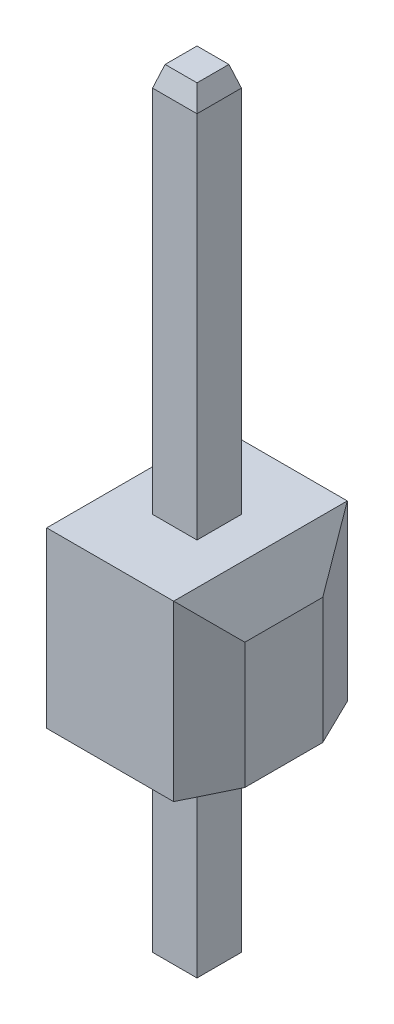
ISO-10303-21;
HEADER;
FILE_DESCRIPTION(('STEP AP214'),'2;1');
FILE_NAME('part.step','',(''),(''),'','','');
FILE_SCHEMA(('AUTOMOTIVE_DESIGN { 1 0 10303 214 1 1 1 1 }'));
ENDSEC;
DATA;
#1=APPLICATION_CONTEXT('core data for automotive mechanical design processes');
#2=APPLICATION_PROTOCOL_DEFINITION('international standard','automotive_design',2000,#1);
#3=PRODUCT_CONTEXT('',#1,'mechanical');
#4=PRODUCT('Part','Part','',(#3));
#5=PRODUCT_RELATED_PRODUCT_CATEGORY('part','',(#4));
#6=PRODUCT_DEFINITION_FORMATION('','',#4);
#7=PRODUCT_DEFINITION_CONTEXT('part definition',#1,'design');
#8=PRODUCT_DEFINITION('design','',#6,#7);
#9=PRODUCT_DEFINITION_SHAPE('','',#8);
#10=(LENGTH_UNIT() NAMED_UNIT(*) SI_UNIT(.MILLI.,.METRE.));
#11=(NAMED_UNIT(*) PLANE_ANGLE_UNIT() SI_UNIT($,.RADIAN.));
#12=(NAMED_UNIT(*) SI_UNIT($,.STERADIAN.) SOLID_ANGLE_UNIT());
#13=UNCERTAINTY_MEASURE_WITH_UNIT(LENGTH_MEASURE(1.E-05),#10,'distance_accuracy_value','');
#14=(GEOMETRIC_REPRESENTATION_CONTEXT(3) GLOBAL_UNCERTAINTY_ASSIGNED_CONTEXT((#13)) GLOBAL_UNIT_ASSIGNED_CONTEXT((#10,
#11,#12)) REPRESENTATION_CONTEXT('',''));
#15=CARTESIAN_POINT('',(0.,0.,0.));
#16=DIRECTION('',(0.,0.,1.));
#17=DIRECTION('',(1.,0.,0.));
#18=AXIS2_PLACEMENT_3D('',#15,#16,#17);
#19=CARTESIAN_POINT('',(1.27,2.54,1.27));
#20=DIRECTION('',(-1.,0.,0.));
#21=DIRECTION('',(0.,0.,1.));
#22=AXIS2_PLACEMENT_3D('',#19,#20,#21);
#23=PLANE('',#22);
#24=DIRECTION('',(0.,0.,-1.));
#25=VECTOR('',#24,1.);
#26=CARTESIAN_POINT('',(1.27,0.,1.27));
#27=LINE('',#26,#25);
#28=CARTESIAN_POINT('',(1.27,0.,0.569999999999992));
#29=VERTEX_POINT('',#28);
#30=CARTESIAN_POINT('',(1.27,0.,-0.569999999999992));
#31=VERTEX_POINT('',#30);
#32=EDGE_CURVE('E206',#29,#31,#27,.T.);
#33=ORIENTED_EDGE('',*,*,#32,.T.);
#34=DIRECTION('',(0.,1.,0.));
#35=VECTOR('',#34,1.);
#36=CARTESIAN_POINT('',(1.27,2.54,-0.569999999999992));
#37=LINE('',#36,#35);
#38=CARTESIAN_POINT('',(1.27,1.83999999999999,-0.569999999999992));
#39=VERTEX_POINT('',#38);
#40=EDGE_CURVE('E300',#31,#39,#37,.T.);
#41=ORIENTED_EDGE('',*,*,#40,.T.);
#42=DIRECTION('',(0.,0.,1.));
#43=VECTOR('',#42,1.);
#44=CARTESIAN_POINT('',(1.27,1.83999999999999,1.27));
#45=LINE('',#44,#43);
#46=CARTESIAN_POINT('',(1.27,1.83999999999999,0.569999999999992));
#47=VERTEX_POINT('',#46);
#48=EDGE_CURVE('E296',#39,#47,#45,.T.);
#49=ORIENTED_EDGE('',*,*,#48,.T.);
#50=DIRECTION('',(0.,-1.,0.));
#51=VECTOR('',#50,1.);
#52=CARTESIAN_POINT('',(1.27,2.54,0.569999999999992));
#53=LINE('',#52,#51);
#54=EDGE_CURVE('E298',#47,#29,#53,.T.);
#55=ORIENTED_EDGE('',*,*,#54,.T.);
#56=EDGE_LOOP('',(#33,#41,#49,#55));
#57=FACE_BOUND('',#56,.T.);
#58=ADVANCED_FACE('F35',(#57),#23,.F.);
#59=CARTESIAN_POINT('',(-1.27,2.54,-1.27));
#60=DIRECTION('',(0.,0.,1.));
#61=DIRECTION('',(1.,0.,0.));
#62=AXIS2_PLACEMENT_3D('',#59,#60,#61);
#63=PLANE('',#62);
#64=DIRECTION('',(-1.,0.,0.));
#65=VECTOR('',#64,1.);
#66=CARTESIAN_POINT('',(-1.27,0.,-1.27));
#67=LINE('',#66,#65);
#68=CARTESIAN_POINT('',(0.928587188003895,0.,-1.27));
#69=VERTEX_POINT('',#68);
#70=CARTESIAN_POINT('',(-0.928587188003895,0.,-1.27));
#71=VERTEX_POINT('',#70);
#72=EDGE_CURVE('E215',#69,#71,#67,.T.);
#73=ORIENTED_EDGE('',*,*,#72,.T.);
#74=DIRECTION('',(0.,1.,0.));
#75=VECTOR('',#74,1.);
#76=CARTESIAN_POINT('',(-0.928587188003895,2.54,-1.27));
#77=LINE('',#76,#75);
#78=CARTESIAN_POINT('',(-0.928587188003895,2.54,-1.27));
#79=VERTEX_POINT('',#78);
#80=EDGE_CURVE('E58',#71,#79,#77,.T.);
#81=ORIENTED_EDGE('',*,*,#80,.T.);
#82=DIRECTION('',(-1.,0.,0.));
#83=VECTOR('',#82,1.);
#84=CARTESIAN_POINT('',(-1.27,2.54,-1.27));
#85=LINE('',#84,#83);
#86=CARTESIAN_POINT('',(0.928587188003895,2.54,-1.27));
#87=VERTEX_POINT('',#86);
#88=EDGE_CURVE('E207',#87,#79,#85,.T.);
#89=ORIENTED_EDGE('',*,*,#88,.F.);
#90=DIRECTION('',(0.,-1.,0.));
#91=VECTOR('',#90,1.);
#92=CARTESIAN_POINT('',(0.928587188003895,2.54,-1.27));
#93=LINE('',#92,#91);
#94=EDGE_CURVE('E267',#87,#69,#93,.T.);
#95=ORIENTED_EDGE('',*,*,#94,.T.);
#96=EDGE_LOOP('',(#73,#81,#89,#95));
#97=FACE_BOUND('',#96,.T.);
#98=ADVANCED_FACE('F357',(#97),#63,.F.);
#99=CARTESIAN_POINT('',(-1.27,2.54,1.27));
#100=DIRECTION('',(1.,0.,0.));
#101=DIRECTION('',(0.,0.,-1.));
#102=AXIS2_PLACEMENT_3D('',#99,#100,#101);
#103=PLANE('',#102);
#104=DIRECTION('',(0.,0.,-1.));
#105=VECTOR('',#104,1.);
#106=CARTESIAN_POINT('',(-1.27,1.83999999999999,1.27));
#107=LINE('',#106,#105);
#108=CARTESIAN_POINT('',(-1.27,1.83999999999999,0.569999999999992));
#109=VERTEX_POINT('',#108);
#110=CARTESIAN_POINT('',(-1.27,1.83999999999999,-0.569999999999992));
#111=VERTEX_POINT('',#110);
#112=EDGE_CURVE('E307',#109,#111,#107,.T.);
#113=ORIENTED_EDGE('',*,*,#112,.T.);
#114=DIRECTION('',(0.,-1.,0.));
#115=VECTOR('',#114,1.);
#116=CARTESIAN_POINT('',(-1.27,2.54,-0.569999999999992));
#117=LINE('',#116,#115);
#118=CARTESIAN_POINT('',(-1.27,0.,-0.569999999999992));
#119=VERTEX_POINT('',#118);
#120=EDGE_CURVE('E316',#111,#119,#117,.T.);
#121=ORIENTED_EDGE('',*,*,#120,.T.);
#122=DIRECTION('',(0.,0.,1.));
#123=VECTOR('',#122,1.);
#124=CARTESIAN_POINT('',(-1.27,0.,1.27));
#125=LINE('',#124,#123);
#126=CARTESIAN_POINT('',(-1.27,0.,0.569999999999992));
#127=VERTEX_POINT('',#126);
#128=EDGE_CURVE('E217',#119,#127,#125,.T.);
#129=ORIENTED_EDGE('',*,*,#128,.T.);
#130=DIRECTION('',(0.,1.,0.));
#131=VECTOR('',#130,1.);
#132=CARTESIAN_POINT('',(-1.27,2.54,0.569999999999992));
#133=LINE('',#132,#131);
#134=EDGE_CURVE('E314',#127,#109,#133,.T.);
#135=ORIENTED_EDGE('',*,*,#134,.T.);
#136=EDGE_LOOP('',(#113,#121,#129,#135));
#137=FACE_BOUND('',#136,.T.);
#138=ADVANCED_FACE('F362',(#137),#103,.F.);
#139=CARTESIAN_POINT('',(-1.27,2.54,1.27));
#140=DIRECTION('',(0.,0.,-1.));
#141=DIRECTION('',(-1.,0.,0.));
#142=AXIS2_PLACEMENT_3D('',#139,#140,#141);
#143=PLANE('',#142);
#144=DIRECTION('',(1.,0.,0.));
#145=VECTOR('',#144,1.);
#146=CARTESIAN_POINT('',(-1.27,2.54,1.27));
#147=LINE('',#146,#145);
#148=CARTESIAN_POINT('',(-0.928587188003895,2.54,1.27));
#149=VERTEX_POINT('',#148);
#150=CARTESIAN_POINT('',(0.928587188003895,2.54,1.27));
#151=VERTEX_POINT('',#150);
#152=EDGE_CURVE('E209',#149,#151,#147,.T.);
#153=ORIENTED_EDGE('',*,*,#152,.F.);
#154=DIRECTION('',(0.,-1.,0.));
#155=VECTOR('',#154,1.);
#156=CARTESIAN_POINT('',(-0.928587188003895,2.54,1.27));
#157=LINE('',#156,#155);
#158=CARTESIAN_POINT('',(-0.928587188003895,0.,1.27));
#159=VERTEX_POINT('',#158);
#160=EDGE_CURVE('E44',#149,#159,#157,.T.);
#161=ORIENTED_EDGE('',*,*,#160,.T.);
#162=DIRECTION('',(1.,0.,0.));
#163=VECTOR('',#162,1.);
#164=CARTESIAN_POINT('',(-1.27,0.,1.27));
#165=LINE('',#164,#163);
#166=CARTESIAN_POINT('',(0.928587188003895,0.,1.27));
#167=VERTEX_POINT('',#166);
#168=EDGE_CURVE('E210',#159,#167,#165,.T.);
#169=ORIENTED_EDGE('',*,*,#168,.T.);
#170=DIRECTION('',(0.,1.,0.));
#171=VECTOR('',#170,1.);
#172=CARTESIAN_POINT('',(0.928587188003895,2.54,1.27));
#173=LINE('',#172,#171);
#174=EDGE_CURVE('E302',#167,#151,#173,.T.);
#175=ORIENTED_EDGE('',*,*,#174,.T.);
#176=EDGE_LOOP('',(#153,#161,#169,#175));
#177=FACE_BOUND('',#176,.T.);
#178=ADVANCED_FACE('F340',(#177),#143,.F.);
#179=CARTESIAN_POINT('',(0.,2.54,0.));
#180=DIRECTION('',(0.,-1.,0.));
#181=DIRECTION('',(0.,0.,-1.));
#182=AXIS2_PLACEMENT_3D('',#179,#180,#181);
#183=PLANE('',#182);
#184=DIRECTION('',(-1.,0.,0.));
#185=VECTOR('',#184,1.);
#186=CARTESIAN_POINT('',(0.,2.54,0.325));
#187=LINE('',#186,#185);
#188=CARTESIAN_POINT('',(0.325,2.54,0.325));
#189=VERTEX_POINT('',#188);
#190=CARTESIAN_POINT('',(-0.325,2.54,0.325));
#191=VERTEX_POINT('',#190);
#192=EDGE_CURVE('E174',#189,#191,#187,.T.);
#193=ORIENTED_EDGE('',*,*,#192,.T.);
#194=DIRECTION('',(0.,0.,-1.));
#195=VECTOR('',#194,1.);
#196=CARTESIAN_POINT('',(-0.325,2.54,0.));
#197=LINE('',#196,#195);
#198=CARTESIAN_POINT('',(-0.325,2.54,-0.325));
#199=VERTEX_POINT('',#198);
#200=EDGE_CURVE('E201',#191,#199,#197,.T.);
#201=ORIENTED_EDGE('',*,*,#200,.T.);
#202=DIRECTION('',(1.,0.,0.));
#203=VECTOR('',#202,1.);
#204=CARTESIAN_POINT('',(0.,2.54,-0.325));
#205=LINE('',#204,#203);
#206=CARTESIAN_POINT('',(0.325,2.54,-0.325));
#207=VERTEX_POINT('',#206);
#208=EDGE_CURVE('E199',#199,#207,#205,.T.);
#209=ORIENTED_EDGE('',*,*,#208,.T.);
#210=DIRECTION('',(0.,0.,1.));
#211=VECTOR('',#210,1.);
#212=CARTESIAN_POINT('',(0.325,2.54,0.));
#213=LINE('',#212,#211);
#214=EDGE_CURVE('E185',#207,#189,#213,.T.);
#215=ORIENTED_EDGE('',*,*,#214,.T.);
#216=EDGE_LOOP('',(#193,#201,#209,#215));
#217=FACE_BOUND('',#216,.T.);
#218=ORIENTED_EDGE('',*,*,#88,.T.);
#219=DIRECTION('',(0.,0.,1.));
#220=VECTOR('',#219,1.);
#221=CARTESIAN_POINT('',(-0.928587188003895,2.54,0.));
#222=LINE('',#221,#220);
#223=EDGE_CURVE('E11',#79,#149,#222,.T.);
#224=ORIENTED_EDGE('',*,*,#223,.T.);
#225=ORIENTED_EDGE('',*,*,#152,.T.);
#226=DIRECTION('',(0.,0.,-1.));
#227=VECTOR('',#226,1.);
#228=CARTESIAN_POINT('',(0.928587188003895,2.54,0.));
#229=LINE('',#228,#227);
#230=EDGE_CURVE('E305',#151,#87,#229,.T.);
#231=ORIENTED_EDGE('',*,*,#230,.T.);
#232=EDGE_LOOP('',(#218,#224,#225,#231));
#233=FACE_BOUND('',#232,.T.);
#234=ADVANCED_FACE('F198',(#217,#233),#183,.F.);
#235=CARTESIAN_POINT('',(0.,0.,0.));
#236=DIRECTION('',(0.,-1.,0.));
#237=DIRECTION('',(0.,0.,-1.));
#238=AXIS2_PLACEMENT_3D('',#235,#236,#237);
#239=PLANE('',#238);
#240=DIRECTION('',(0.,0.,-1.));
#241=VECTOR('',#240,1.);
#242=CARTESIAN_POINT('',(-0.325,0.,0.));
#243=LINE('',#242,#241);
#244=CARTESIAN_POINT('',(-0.325,0.,0.325));
#245=VERTEX_POINT('',#244);
#246=CARTESIAN_POINT('',(-0.325,0.,-0.325));
#247=VERTEX_POINT('',#246);
#248=EDGE_CURVE('E229',#245,#247,#243,.T.);
#249=ORIENTED_EDGE('',*,*,#248,.F.);
#250=DIRECTION('',(-1.,0.,0.));
#251=VECTOR('',#250,1.);
#252=CARTESIAN_POINT('',(0.,0.,0.325));
#253=LINE('',#252,#251);
#254=CARTESIAN_POINT('',(0.325,0.,0.325));
#255=VERTEX_POINT('',#254);
#256=EDGE_CURVE('E212',#255,#245,#253,.T.);
#257=ORIENTED_EDGE('',*,*,#256,.F.);
#258=DIRECTION('',(0.,0.,1.));
#259=VECTOR('',#258,1.);
#260=CARTESIAN_POINT('',(0.325,0.,0.));
#261=LINE('',#260,#259);
#262=CARTESIAN_POINT('',(0.325,0.,-0.325));
#263=VERTEX_POINT('',#262);
#264=EDGE_CURVE('E223',#263,#255,#261,.T.);
#265=ORIENTED_EDGE('',*,*,#264,.F.);
#266=DIRECTION('',(1.,0.,0.));
#267=VECTOR('',#266,1.);
#268=CARTESIAN_POINT('',(0.,0.,-0.325));
#269=LINE('',#268,#267);
#270=EDGE_CURVE('E226',#247,#263,#269,.T.);
#271=ORIENTED_EDGE('',*,*,#270,.F.);
#272=EDGE_LOOP('',(#249,#257,#265,#271));
#273=FACE_BOUND('',#272,.T.);
#274=ORIENTED_EDGE('',*,*,#128,.F.);
#275=DIRECTION('',(-0.438371146789076,0.,0.898794046299168));
#276=VECTOR('',#275,1.);
#277=CARTESIAN_POINT('',(-1.25052810160971,0.,-0.609923308072452));
#278=LINE('',#277,#276);
#279=EDGE_CURVE('E321',#119,#71,#278,.F.);
#280=ORIENTED_EDGE('',*,*,#279,.T.);
#281=ORIENTED_EDGE('',*,*,#72,.F.);
#282=DIRECTION('',(-0.438371146789076,0.,-0.898794046299168));
#283=VECTOR('',#282,1.);
#284=CARTESIAN_POINT('',(1.25052810160971,0.,-0.609923308072452));
#285=LINE('',#284,#283);
#286=EDGE_CURVE('E294',#69,#31,#285,.F.);
#287=ORIENTED_EDGE('',*,*,#286,.T.);
#288=ORIENTED_EDGE('',*,*,#32,.F.);
#289=DIRECTION('',(0.438371146789076,0.,-0.898794046299168));
#290=VECTOR('',#289,1.);
#291=CARTESIAN_POINT('',(1.25052810160971,0.,0.609923308072452));
#292=LINE('',#291,#290);
#293=EDGE_CURVE('E291',#29,#167,#292,.F.);
#294=ORIENTED_EDGE('',*,*,#293,.T.);
#295=ORIENTED_EDGE('',*,*,#168,.F.);
#296=DIRECTION('',(0.438371146789076,0.,0.898794046299168));
#297=VECTOR('',#296,1.);
#298=CARTESIAN_POINT('',(-1.25052810160971,0.,0.609923308072452));
#299=LINE('',#298,#297);
#300=EDGE_CURVE('E319',#159,#127,#299,.F.);
#301=ORIENTED_EDGE('',*,*,#300,.T.);
#302=EDGE_LOOP('',(#274,#280,#281,#287,#288,#294,#295,#301));
#303=FACE_BOUND('',#302,.T.);
#304=ADVANCED_FACE('F343',(#273,#303),#239,.T.);
#305=CARTESIAN_POINT('',(0.,-3.1,0.));
#306=DIRECTION('',(0.,1.,0.));
#307=DIRECTION('',(0.,0.,1.));
#308=AXIS2_PLACEMENT_3D('',#305,#306,#307);
#309=PLANE('',#308);
#310=DIRECTION('',(1.,0.,0.));
#311=VECTOR('',#310,1.);
#312=CARTESIAN_POINT('',(0.325,-3.1,-0.0249999999999984));
#313=LINE('',#312,#311);
#314=CARTESIAN_POINT('',(-0.0249999999999982,-3.1,-0.0249999999999983));
#315=VERTEX_POINT('',#314);
#316=CARTESIAN_POINT('',(0.0249999999999983,-3.1,-0.0249999999999983));
#317=VERTEX_POINT('',#316);
#318=EDGE_CURVE('E239',#315,#317,#313,.T.);
#319=ORIENTED_EDGE('',*,*,#318,.T.);
#320=DIRECTION('',(0.,0.,1.));
#321=VECTOR('',#320,1.);
#322=CARTESIAN_POINT('',(0.0249999999999983,-3.1,0.325));
#323=LINE('',#322,#321);
#324=CARTESIAN_POINT('',(0.0249999999999983,-3.1,0.0249999999999983));
#325=VERTEX_POINT('',#324);
#326=EDGE_CURVE('E241',#317,#325,#323,.T.);
#327=ORIENTED_EDGE('',*,*,#326,.T.);
#328=DIRECTION('',(-1.,0.,0.));
#329=VECTOR('',#328,1.);
#330=CARTESIAN_POINT('',(-0.325,-3.1,0.0249999999999984));
#331=LINE('',#330,#329);
#332=CARTESIAN_POINT('',(-0.0249999999999982,-3.1,0.0249999999999983));
#333=VERTEX_POINT('',#332);
#334=EDGE_CURVE('E237',#325,#333,#331,.T.);
#335=ORIENTED_EDGE('',*,*,#334,.T.);
#336=DIRECTION('',(0.,0.,-1.));
#337=VECTOR('',#336,1.);
#338=CARTESIAN_POINT('',(-0.0249999999999982,-3.1,-0.325));
#339=LINE('',#338,#337);
#340=EDGE_CURVE('E235',#333,#315,#339,.T.);
#341=ORIENTED_EDGE('',*,*,#340,.T.);
#342=EDGE_LOOP('',(#319,#327,#335,#341));
#343=FACE_BOUND('',#342,.T.);
#344=ADVANCED_FACE('F533',(#343),#309,.F.);
#345=CARTESIAN_POINT('',(0.325,-3.1,0.325));
#346=DIRECTION('',(0.,0.,1.));
#347=DIRECTION('',(1.,0.,0.));
#348=AXIS2_PLACEMENT_3D('',#345,#346,#347);
#349=PLANE('',#348);
#350=DIRECTION('',(0.,1.,0.));
#351=VECTOR('',#350,1.);
#352=CARTESIAN_POINT('',(-0.325,-3.1,0.325));
#353=LINE('',#352,#351);
#354=CARTESIAN_POINT('',(-0.325,-3.0082807955624,0.325));
#355=VERTEX_POINT('',#354);
#356=EDGE_CURVE('E195',#355,#245,#353,.T.);
#357=ORIENTED_EDGE('',*,*,#356,.F.);
#358=DIRECTION('',(1.,0.,0.));
#359=VECTOR('',#358,1.);
#360=CARTESIAN_POINT('',(0.325,-3.0082807955624,0.325));
#361=LINE('',#360,#359);
#362=CARTESIAN_POINT('',(0.325,-3.0082807955624,0.325));
#363=VERTEX_POINT('',#362);
#364=EDGE_CURVE('E246',#355,#363,#361,.T.);
#365=ORIENTED_EDGE('',*,*,#364,.T.);
#366=DIRECTION('',(0.,1.,0.));
#367=VECTOR('',#366,1.);
#368=CARTESIAN_POINT('',(0.325,-3.1,0.325));
#369=LINE('',#368,#367);
#370=EDGE_CURVE('E194',#363,#255,#369,.T.);
#371=ORIENTED_EDGE('',*,*,#370,.T.);
#372=ORIENTED_EDGE('',*,*,#256,.T.);
#373=EDGE_LOOP('',(#357,#365,#371,#372));
#374=FACE_BOUND('',#373,.T.);
#375=ADVANCED_FACE('F484',(#374),#349,.T.);
#376=CARTESIAN_POINT('',(0.325,-3.1,0.325));
#377=DIRECTION('',(1.,0.,0.));
#378=DIRECTION('',(0.,0.,-1.));
#379=AXIS2_PLACEMENT_3D('',#376,#377,#378);
#380=PLANE('',#379);
#381=ORIENTED_EDGE('',*,*,#370,.F.);
#382=DIRECTION('',(0.,0.,-1.));
#383=VECTOR('',#382,1.);
#384=CARTESIAN_POINT('',(0.325,-3.0082807955624,-0.325));
#385=LINE('',#384,#383);
#386=CARTESIAN_POINT('',(0.325,-3.0082807955624,-0.325));
#387=VERTEX_POINT('',#386);
#388=EDGE_CURVE('E232',#363,#387,#385,.T.);
#389=ORIENTED_EDGE('',*,*,#388,.T.);
#390=DIRECTION('',(0.,1.,0.));
#391=VECTOR('',#390,1.);
#392=CARTESIAN_POINT('',(0.325,-3.1,-0.325));
#393=LINE('',#392,#391);
#394=EDGE_CURVE('E643',#387,#263,#393,.T.);
#395=ORIENTED_EDGE('',*,*,#394,.T.);
#396=ORIENTED_EDGE('',*,*,#264,.T.);
#397=EDGE_LOOP('',(#381,#389,#395,#396));
#398=FACE_BOUND('',#397,.T.);
#399=ADVANCED_FACE('F492',(#398),#380,.T.);
#400=CARTESIAN_POINT('',(0.325,-3.1,-0.325));
#401=DIRECTION('',(0.,0.,-1.));
#402=DIRECTION('',(-1.,0.,0.));
#403=AXIS2_PLACEMENT_3D('',#400,#401,#402);
#404=PLANE('',#403);
#405=ORIENTED_EDGE('',*,*,#394,.F.);
#406=DIRECTION('',(-1.,0.,0.));
#407=VECTOR('',#406,1.);
#408=CARTESIAN_POINT('',(-0.325,-3.0082807955624,-0.325));
#409=LINE('',#408,#407);
#410=CARTESIAN_POINT('',(-0.325,-3.0082807955624,-0.325));
#411=VERTEX_POINT('',#410);
#412=EDGE_CURVE('E244',#387,#411,#409,.T.);
#413=ORIENTED_EDGE('',*,*,#412,.T.);
#414=DIRECTION('',(0.,1.,0.));
#415=VECTOR('',#414,1.);
#416=CARTESIAN_POINT('',(-0.325,-3.1,-0.325));
#417=LINE('',#416,#415);
#418=EDGE_CURVE('E186',#411,#247,#417,.T.);
#419=ORIENTED_EDGE('',*,*,#418,.T.);
#420=ORIENTED_EDGE('',*,*,#270,.T.);
#421=EDGE_LOOP('',(#405,#413,#419,#420));
#422=FACE_BOUND('',#421,.T.);
#423=ADVANCED_FACE('F501',(#422),#404,.T.);
#424=CARTESIAN_POINT('',(-0.325,-3.1,0.325));
#425=DIRECTION('',(-1.,0.,0.));
#426=DIRECTION('',(0.,0.,1.));
#427=AXIS2_PLACEMENT_3D('',#424,#425,#426);
#428=PLANE('',#427);
#429=ORIENTED_EDGE('',*,*,#418,.F.);
#430=DIRECTION('',(0.,0.,1.));
#431=VECTOR('',#430,1.);
#432=CARTESIAN_POINT('',(-0.325,-3.0082807955624,0.325));
#433=LINE('',#432,#431);
#434=EDGE_CURVE('E248',#411,#355,#433,.T.);
#435=ORIENTED_EDGE('',*,*,#434,.T.);
#436=ORIENTED_EDGE('',*,*,#356,.T.);
#437=ORIENTED_EDGE('',*,*,#248,.T.);
#438=EDGE_LOOP('',(#429,#435,#436,#437));
#439=FACE_BOUND('',#438,.T.);
#440=ADVANCED_FACE('F507',(#439),#428,.T.);
#441=CARTESIAN_POINT('',(-0.325,7.94,0.325));
#442=VERTEX_POINT('',#441);
#443=EDGE_CURVE('E180',#191,#442,#353,.T.);
#444=ORIENTED_EDGE('',*,*,#443,.T.);
#445=DIRECTION('',(0.,0.,-1.));
#446=VECTOR('',#445,1.);
#447=CARTESIAN_POINT('',(-0.325,7.94,0.325));
#448=LINE('',#447,#446);
#449=CARTESIAN_POINT('',(-0.325,7.94,-0.325));
#450=VERTEX_POINT('',#449);
#451=EDGE_CURVE('E262',#442,#450,#448,.T.);
#452=ORIENTED_EDGE('',*,*,#451,.T.);
#453=EDGE_CURVE('E657',#199,#450,#417,.T.);
#454=ORIENTED_EDGE('',*,*,#453,.F.);
#455=ORIENTED_EDGE('',*,*,#200,.F.);
#456=EDGE_LOOP('',(#444,#452,#454,#455));
#457=FACE_BOUND('',#456,.T.);
#458=ADVANCED_FACE('F498',(#457),#428,.T.);
#459=ORIENTED_EDGE('',*,*,#453,.T.);
#460=DIRECTION('',(1.,0.,0.));
#461=VECTOR('',#460,1.);
#462=CARTESIAN_POINT('',(0.325,7.94,-0.325));
#463=LINE('',#462,#461);
#464=CARTESIAN_POINT('',(0.325,7.94,-0.325));
#465=VERTEX_POINT('',#464);
#466=EDGE_CURVE('E259',#450,#465,#463,.T.);
#467=ORIENTED_EDGE('',*,*,#466,.T.);
#468=EDGE_CURVE('E642',#207,#465,#393,.T.);
#469=ORIENTED_EDGE('',*,*,#468,.F.);
#470=ORIENTED_EDGE('',*,*,#208,.F.);
#471=EDGE_LOOP('',(#459,#467,#469,#470));
#472=FACE_BOUND('',#471,.T.);
#473=ADVANCED_FACE('F490',(#472),#404,.T.);
#474=ORIENTED_EDGE('',*,*,#468,.T.);
#475=DIRECTION('',(0.,0.,1.));
#476=VECTOR('',#475,1.);
#477=CARTESIAN_POINT('',(0.325,7.94,0.325));
#478=LINE('',#477,#476);
#479=CARTESIAN_POINT('',(0.325,7.94,0.325));
#480=VERTEX_POINT('',#479);
#481=EDGE_CURVE('E193',#465,#480,#478,.T.);
#482=ORIENTED_EDGE('',*,*,#481,.T.);
#483=EDGE_CURVE('E177',#189,#480,#369,.T.);
#484=ORIENTED_EDGE('',*,*,#483,.F.);
#485=ORIENTED_EDGE('',*,*,#214,.F.);
#486=EDGE_LOOP('',(#474,#482,#484,#485));
#487=FACE_BOUND('',#486,.T.);
#488=ADVANCED_FACE('F190',(#487),#380,.T.);
#489=ORIENTED_EDGE('',*,*,#483,.T.);
#490=DIRECTION('',(-1.,0.,0.));
#491=VECTOR('',#490,1.);
#492=CARTESIAN_POINT('',(0.325,7.94,0.325));
#493=LINE('',#492,#491);
#494=EDGE_CURVE('E264',#480,#442,#493,.T.);
#495=ORIENTED_EDGE('',*,*,#494,.T.);
#496=ORIENTED_EDGE('',*,*,#443,.F.);
#497=ORIENTED_EDGE('',*,*,#192,.F.);
#498=EDGE_LOOP('',(#489,#495,#496,#497));
#499=FACE_BOUND('',#498,.T.);
#500=ADVANCED_FACE('F176',(#499),#349,.T.);
#501=CARTESIAN_POINT('',(0.,8.24,0.));
#502=DIRECTION('',(0.,1.,0.));
#503=DIRECTION('',(0.,0.,1.));
#504=AXIS2_PLACEMENT_3D('',#501,#502,#503);
#505=PLANE('',#504);
#506=DIRECTION('',(0.,0.,-1.));
#507=VECTOR('',#506,1.);
#508=CARTESIAN_POINT('',(0.233280795562402,8.24,0.));
#509=LINE('',#508,#507);
#510=CARTESIAN_POINT('',(0.233280795562402,8.24,0.233280795562401));
#511=VERTEX_POINT('',#510);
#512=CARTESIAN_POINT('',(0.233280795562402,8.24,-0.233280795562402));
#513=VERTEX_POINT('',#512);
#514=EDGE_CURVE('E250',#511,#513,#509,.T.);
#515=ORIENTED_EDGE('',*,*,#514,.T.);
#516=DIRECTION('',(-1.,0.,0.));
#517=VECTOR('',#516,1.);
#518=CARTESIAN_POINT('',(0.,8.24,-0.233280795562401));
#519=LINE('',#518,#517);
#520=CARTESIAN_POINT('',(-0.233280795562402,8.24,-0.233280795562401));
#521=VERTEX_POINT('',#520);
#522=EDGE_CURVE('E256',#513,#521,#519,.T.);
#523=ORIENTED_EDGE('',*,*,#522,.T.);
#524=DIRECTION('',(0.,0.,1.));
#525=VECTOR('',#524,1.);
#526=CARTESIAN_POINT('',(-0.233280795562401,8.24,0.));
#527=LINE('',#526,#525);
#528=CARTESIAN_POINT('',(-0.233280795562401,8.24,0.233280795562402));
#529=VERTEX_POINT('',#528);
#530=EDGE_CURVE('E254',#521,#529,#527,.T.);
#531=ORIENTED_EDGE('',*,*,#530,.T.);
#532=DIRECTION('',(1.,0.,0.));
#533=VECTOR('',#532,1.);
#534=CARTESIAN_POINT('',(0.,8.24,0.233280795562402));
#535=LINE('',#534,#533);
#536=EDGE_CURVE('E252',#529,#511,#535,.T.);
#537=ORIENTED_EDGE('',*,*,#536,.T.);
#538=EDGE_LOOP('',(#515,#523,#531,#537));
#539=FACE_BOUND('',#538,.T.);
#540=ADVANCED_FACE('F393',(#539),#505,.T.);
#541=CARTESIAN_POINT('',(-0.325,-3.0082807955624,0.325));
#542=DIRECTION('',(-0.292371704722735,-0.956304755963036,0.));
#543=DIRECTION('',(0.,0.,-1.));
#544=AXIS2_PLACEMENT_3D('',#541,#542,#543);
#545=PLANE('',#544);
#546=DIRECTION('',(0.691140749344681,-0.211302932280997,0.69114074934468));
#547=VECTOR('',#546,1.);
#548=CARTESIAN_POINT('',(-0.014510901986928,-3.10320683908342,-0.0145109019869281));
#549=LINE('',#548,#547);
#550=EDGE_CURVE('E273',#315,#411,#549,.F.);
#551=ORIENTED_EDGE('',*,*,#550,.F.);
#552=ORIENTED_EDGE('',*,*,#340,.F.);
#553=DIRECTION('',(-0.69114074934468,0.211302932280997,0.69114074934468));
#554=VECTOR('',#553,1.);
#555=CARTESIAN_POINT('',(-0.325,-3.0082807955624,0.325));
#556=LINE('',#555,#554);
#557=EDGE_CURVE('E276',#355,#333,#556,.F.);
#558=ORIENTED_EDGE('',*,*,#557,.F.);
#559=ORIENTED_EDGE('',*,*,#434,.F.);
#560=EDGE_LOOP('',(#551,#552,#558,#559));
#561=FACE_BOUND('',#560,.T.);
#562=ADVANCED_FACE('F389',(#561),#545,.T.);
#563=CARTESIAN_POINT('',(0.325,-3.0082807955624,0.325));
#564=DIRECTION('',(0.,-0.956304755963036,0.292371704722735));
#565=DIRECTION('',(-1.,0.,0.));
#566=AXIS2_PLACEMENT_3D('',#563,#564,#565);
#567=PLANE('',#566);
#568=ORIENTED_EDGE('',*,*,#557,.T.);
#569=ORIENTED_EDGE('',*,*,#334,.F.);
#570=DIRECTION('',(0.69114074934468,0.211302932280997,0.69114074934468));
#571=VECTOR('',#570,1.);
#572=CARTESIAN_POINT('',(0.325,-3.0082807955624,0.325));
#573=LINE('',#572,#571);
#574=EDGE_CURVE('E270',#363,#325,#573,.F.);
#575=ORIENTED_EDGE('',*,*,#574,.F.);
#576=ORIENTED_EDGE('',*,*,#364,.F.);
#577=EDGE_LOOP('',(#568,#569,#575,#576));
#578=FACE_BOUND('',#577,.T.);
#579=ADVANCED_FACE('F385',(#578),#567,.T.);
#580=CARTESIAN_POINT('',(0.325,-3.0082807955624,-0.325));
#581=DIRECTION('',(0.,-0.956304755963036,-0.292371704722735));
#582=DIRECTION('',(1.,0.,0.));
#583=AXIS2_PLACEMENT_3D('',#580,#581,#582);
#584=PLANE('',#583);
#585=ORIENTED_EDGE('',*,*,#550,.T.);
#586=ORIENTED_EDGE('',*,*,#412,.F.);
#587=DIRECTION('',(-0.69114074934468,-0.211302932280997,0.69114074934468));
#588=VECTOR('',#587,1.);
#589=CARTESIAN_POINT('',(0.325,-3.0082807955624,-0.325));
#590=LINE('',#589,#588);
#591=EDGE_CURVE('E268',#317,#387,#590,.F.);
#592=ORIENTED_EDGE('',*,*,#591,.F.);
#593=ORIENTED_EDGE('',*,*,#318,.F.);
#594=EDGE_LOOP('',(#585,#586,#592,#593));
#595=FACE_BOUND('',#594,.T.);
#596=ADVANCED_FACE('F381',(#595),#584,.T.);
#597=CARTESIAN_POINT('',(0.325,-3.0082807955624,0.325));
#598=DIRECTION('',(0.292371704722735,-0.956304755963036,0.));
#599=DIRECTION('',(0.,0.,1.));
#600=AXIS2_PLACEMENT_3D('',#597,#598,#599);
#601=PLANE('',#600);
#602=ORIENTED_EDGE('',*,*,#574,.T.);
#603=ORIENTED_EDGE('',*,*,#326,.F.);
#604=ORIENTED_EDGE('',*,*,#591,.T.);
#605=ORIENTED_EDGE('',*,*,#388,.F.);
#606=EDGE_LOOP('',(#602,#603,#604,#605));
#607=FACE_BOUND('',#606,.T.);
#608=ADVANCED_FACE('F377',(#607),#601,.T.);
#609=CARTESIAN_POINT('',(0.,8.24,0.233280795562402));
#610=DIRECTION('',(0.,-0.292371704722735,-0.956304755963036));
#611=DIRECTION('',(1.,0.,0.));
#612=AXIS2_PLACEMENT_3D('',#609,#610,#611);
#613=PLANE('',#612);
#614=DIRECTION('',(-0.280623595142126,-0.917878420979062,0.280623595142126));
#615=VECTOR('',#614,1.);
#616=CARTESIAN_POINT('',(-0.214910025722512,8.30008808063437,0.214910025722512));
#617=LINE('',#616,#615);
#618=EDGE_CURVE('E284',#442,#529,#617,.F.);
#619=ORIENTED_EDGE('',*,*,#618,.F.);
#620=ORIENTED_EDGE('',*,*,#494,.F.);
#621=DIRECTION('',(0.280623595142126,-0.917878420979062,0.280623595142126));
#622=VECTOR('',#621,1.);
#623=CARTESIAN_POINT('',(0.214910025722512,8.30008808063437,0.214910025722512));
#624=LINE('',#623,#622);
#625=EDGE_CURVE('E271',#511,#480,#624,.T.);
#626=ORIENTED_EDGE('',*,*,#625,.F.);
#627=ORIENTED_EDGE('',*,*,#536,.F.);
#628=EDGE_LOOP('',(#619,#620,#626,#627));
#629=FACE_BOUND('',#628,.T.);
#630=ADVANCED_FACE('F380',(#629),#613,.F.);
#631=CARTESIAN_POINT('',(0.233280795562402,8.24,0.));
#632=DIRECTION('',(-0.956304755963036,-0.292371704722735,0.));
#633=DIRECTION('',(0.,0.,-1.));
#634=AXIS2_PLACEMENT_3D('',#631,#632,#633);
#635=PLANE('',#634);
#636=ORIENTED_EDGE('',*,*,#625,.T.);
#637=ORIENTED_EDGE('',*,*,#481,.F.);
#638=DIRECTION('',(-0.280623595142126,0.917878420979062,0.280623595142126));
#639=VECTOR('',#638,1.);
#640=CARTESIAN_POINT('',(0.214910025722512,8.30008808063437,-0.214910025722512));
#641=LINE('',#640,#639);
#642=EDGE_CURVE('E281',#513,#465,#641,.F.);
#643=ORIENTED_EDGE('',*,*,#642,.F.);
#644=ORIENTED_EDGE('',*,*,#514,.F.);
#645=EDGE_LOOP('',(#636,#637,#643,#644));
#646=FACE_BOUND('',#645,.T.);
#647=ADVANCED_FACE('F402',(#646),#635,.F.);
#648=CARTESIAN_POINT('',(-0.233280795562401,8.24,0.));
#649=DIRECTION('',(0.956304755963036,-0.292371704722735,0.));
#650=DIRECTION('',(0.,0.,1.));
#651=AXIS2_PLACEMENT_3D('',#648,#649,#650);
#652=PLANE('',#651);
#653=ORIENTED_EDGE('',*,*,#618,.T.);
#654=ORIENTED_EDGE('',*,*,#530,.F.);
#655=DIRECTION('',(-0.280623595142126,-0.917878420979062,-0.280623595142126));
#656=VECTOR('',#655,1.);
#657=CARTESIAN_POINT('',(-0.214910025722512,8.30008808063437,-0.214910025722512));
#658=LINE('',#657,#656);
#659=EDGE_CURVE('E279',#450,#521,#658,.F.);
#660=ORIENTED_EDGE('',*,*,#659,.F.);
#661=ORIENTED_EDGE('',*,*,#451,.F.);
#662=EDGE_LOOP('',(#653,#654,#660,#661));
#663=FACE_BOUND('',#662,.T.);
#664=ADVANCED_FACE('F398',(#663),#652,.F.);
#665=CARTESIAN_POINT('',(0.,8.24,-0.233280795562401));
#666=DIRECTION('',(0.,-0.292371704722735,0.956304755963036));
#667=DIRECTION('',(-1.,0.,0.));
#668=AXIS2_PLACEMENT_3D('',#665,#666,#667);
#669=PLANE('',#668);
#670=ORIENTED_EDGE('',*,*,#642,.T.);
#671=ORIENTED_EDGE('',*,*,#466,.F.);
#672=ORIENTED_EDGE('',*,*,#659,.T.);
#673=ORIENTED_EDGE('',*,*,#522,.F.);
#674=EDGE_LOOP('',(#670,#671,#672,#673));
#675=FACE_BOUND('',#674,.T.);
#676=ADVANCED_FACE('F395',(#675),#669,.F.);
#677=CARTESIAN_POINT('',(1.27,2.54,0.569999999999992));
#678=DIRECTION('',(-0.898794046299168,0.,-0.438371146789076));
#679=DIRECTION('',(0.,-1.,0.));
#680=AXIS2_PLACEMENT_3D('',#677,#678,#679);
#681=PLANE('',#680);
#682=ORIENTED_EDGE('',*,*,#293,.F.);
#683=ORIENTED_EDGE('',*,*,#54,.F.);
#684=DIRECTION('',(0.326034139782525,-0.668469049282115,-0.668469049282115));
#685=VECTOR('',#684,1.);
#686=CARTESIAN_POINT('',(1.20537572695039,1.97249939529287,0.702499395292869));
#687=LINE('',#686,#685);
#688=EDGE_CURVE('E282',#151,#47,#687,.T.);
#689=ORIENTED_EDGE('',*,*,#688,.F.);
#690=ORIENTED_EDGE('',*,*,#174,.F.);
#691=EDGE_LOOP('',(#682,#683,#689,#690));
#692=FACE_BOUND('',#691,.T.);
#693=ADVANCED_FACE('F350',(#692),#681,.F.);
#694=CARTESIAN_POINT('',(0.928587188003895,2.54,0.));
#695=DIRECTION('',(-0.898794046299168,-0.438371146789076,0.));
#696=DIRECTION('',(0.,0.,-1.));
#697=AXIS2_PLACEMENT_3D('',#694,#695,#696);
#698=PLANE('',#697);
#699=ORIENTED_EDGE('',*,*,#688,.T.);
#700=ORIENTED_EDGE('',*,*,#48,.F.);
#701=DIRECTION('',(-0.326034139782525,0.668469049282115,-0.668469049282115));
#702=VECTOR('',#701,1.);
#703=CARTESIAN_POINT('',(1.20537572695039,1.97249939529287,-0.702499395292869));
#704=LINE('',#703,#702);
#705=EDGE_CURVE('E308',#87,#39,#704,.F.);
#706=ORIENTED_EDGE('',*,*,#705,.F.);
#707=ORIENTED_EDGE('',*,*,#230,.F.);
#708=EDGE_LOOP('',(#699,#700,#706,#707));
#709=FACE_BOUND('',#708,.T.);
#710=ADVANCED_FACE('F355',(#709),#698,.F.);
#711=CARTESIAN_POINT('',(0.928587188003895,2.54,-1.27));
#712=DIRECTION('',(-0.898794046299168,0.,0.438371146789076));
#713=DIRECTION('',(0.,-1.,0.));
#714=AXIS2_PLACEMENT_3D('',#711,#712,#713);
#715=PLANE('',#714);
#716=ORIENTED_EDGE('',*,*,#705,.T.);
#717=ORIENTED_EDGE('',*,*,#40,.F.);
#718=ORIENTED_EDGE('',*,*,#286,.F.);
#719=ORIENTED_EDGE('',*,*,#94,.F.);
#720=EDGE_LOOP('',(#716,#717,#718,#719));
#721=FACE_BOUND('',#720,.T.);
#722=ADVANCED_FACE('F410',(#721),#715,.F.);
#723=CARTESIAN_POINT('',(-0.928587188003895,2.54,1.27));
#724=DIRECTION('',(0.898794046299168,0.,-0.438371146789076));
#725=DIRECTION('',(0.,-1.,0.));
#726=AXIS2_PLACEMENT_3D('',#723,#724,#725);
#727=PLANE('',#726);
#728=ORIENTED_EDGE('',*,*,#300,.F.);
#729=ORIENTED_EDGE('',*,*,#160,.F.);
#730=DIRECTION('',(0.326034139782525,0.668469049282115,0.668469049282115));
#731=VECTOR('',#730,1.);
#732=CARTESIAN_POINT('',(-1.20537572695039,1.97249939529287,0.702499395292869));
#733=LINE('',#732,#731);
#734=EDGE_CURVE('E39',#109,#149,#733,.T.);
#735=ORIENTED_EDGE('',*,*,#734,.F.);
#736=ORIENTED_EDGE('',*,*,#134,.F.);
#737=EDGE_LOOP('',(#728,#729,#735,#736));
#738=FACE_BOUND('',#737,.T.);
#739=ADVANCED_FACE('F37',(#738),#727,.F.);
#740=CARTESIAN_POINT('',(-0.928587188003895,2.54,0.));
#741=DIRECTION('',(0.898794046299168,-0.438371146789076,0.));
#742=DIRECTION('',(0.,0.,1.));
#743=AXIS2_PLACEMENT_3D('',#740,#741,#742);
#744=PLANE('',#743);
#745=ORIENTED_EDGE('',*,*,#734,.T.);
#746=ORIENTED_EDGE('',*,*,#223,.F.);
#747=DIRECTION('',(-0.326034139782525,-0.668469049282115,0.668469049282115));
#748=VECTOR('',#747,1.);
#749=CARTESIAN_POINT('',(-1.20537572695039,1.97249939529287,-0.702499395292869));
#750=LINE('',#749,#748);
#751=EDGE_CURVE('E324',#111,#79,#750,.F.);
#752=ORIENTED_EDGE('',*,*,#751,.F.);
#753=ORIENTED_EDGE('',*,*,#112,.F.);
#754=EDGE_LOOP('',(#745,#746,#752,#753));
#755=FACE_BOUND('',#754,.T.);
#756=ADVANCED_FACE('F333',(#755),#744,.F.);
#757=CARTESIAN_POINT('',(-1.27,2.54,-0.569999999999992));
#758=DIRECTION('',(0.898794046299168,0.,0.438371146789076));
#759=DIRECTION('',(0.,-1.,0.));
#760=AXIS2_PLACEMENT_3D('',#757,#758,#759);
#761=PLANE('',#760);
#762=ORIENTED_EDGE('',*,*,#751,.T.);
#763=ORIENTED_EDGE('',*,*,#80,.F.);
#764=ORIENTED_EDGE('',*,*,#279,.F.);
#765=ORIENTED_EDGE('',*,*,#120,.F.);
#766=EDGE_LOOP('',(#762,#763,#764,#765));
#767=FACE_BOUND('',#766,.T.);
#768=ADVANCED_FACE('F360',(#767),#761,.F.);
#769=CLOSED_SHELL('',(#58,#98,#138,#178,#234,#304,#344,#375,#399,#423,#440,#458,#473,#488,#500,
#540,#562,#579,#596,#608,#630,#647,#664,#676,#693,#710,#722,#739,#756,#768));
#770=MANIFOLD_SOLID_BREP('B2',#769);
#771=ADVANCED_BREP_SHAPE_REPRESENTATION('',(#18,#770),#14);
#772=SHAPE_DEFINITION_REPRESENTATION(#9,#771);
ENDSEC;
END-ISO-10303-21;
